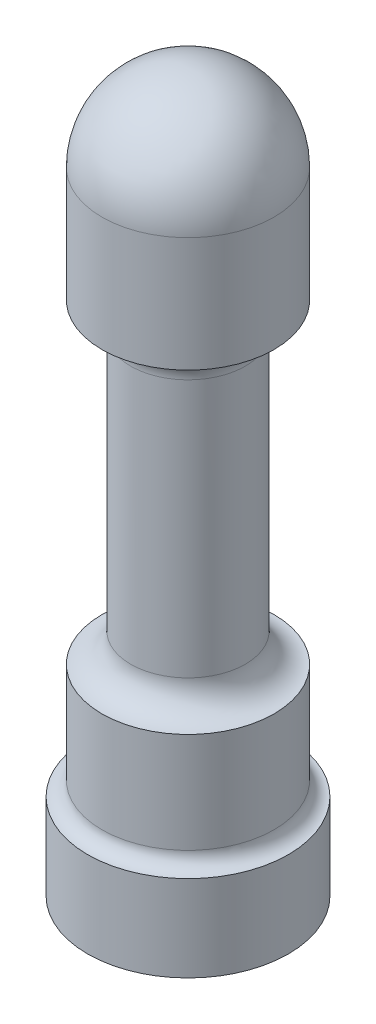
ISO-10303-21;
HEADER;
FILE_DESCRIPTION(('STEP AP214'),'2;1');
FILE_NAME('part.step','',(''),(''),'','','');
FILE_SCHEMA(('AUTOMOTIVE_DESIGN { 1 0 10303 214 1 1 1 1 }'));
ENDSEC;
DATA;
#1=APPLICATION_CONTEXT('core data for automotive mechanical design processes');
#2=APPLICATION_PROTOCOL_DEFINITION('international standard','automotive_design',2000,#1);
#3=PRODUCT_CONTEXT('',#1,'mechanical');
#4=PRODUCT('Part','Part','',(#3));
#5=PRODUCT_RELATED_PRODUCT_CATEGORY('part','',(#4));
#6=PRODUCT_DEFINITION_FORMATION('','',#4);
#7=PRODUCT_DEFINITION_CONTEXT('part definition',#1,'design');
#8=PRODUCT_DEFINITION('design','',#6,#7);
#9=PRODUCT_DEFINITION_SHAPE('','',#8);
#10=(LENGTH_UNIT() NAMED_UNIT(*) SI_UNIT(.MILLI.,.METRE.));
#11=(NAMED_UNIT(*) PLANE_ANGLE_UNIT() SI_UNIT($,.RADIAN.));
#12=(NAMED_UNIT(*) SI_UNIT($,.STERADIAN.) SOLID_ANGLE_UNIT());
#13=UNCERTAINTY_MEASURE_WITH_UNIT(LENGTH_MEASURE(1.E-05),#10,'distance_accuracy_value','');
#14=(GEOMETRIC_REPRESENTATION_CONTEXT(3) GLOBAL_UNCERTAINTY_ASSIGNED_CONTEXT((#13)) GLOBAL_UNIT_ASSIGNED_CONTEXT((#10,
#11,#12)) REPRESENTATION_CONTEXT('',''));
#15=CARTESIAN_POINT('',(0.,0.,0.));
#16=DIRECTION('',(0.,0.,1.));
#17=DIRECTION('',(1.,0.,0.));
#18=AXIS2_PLACEMENT_3D('',#15,#16,#17);
#19=CARTESIAN_POINT('',(0.,0.,0.));
#20=DIRECTION('',(0.,1.,0.));
#21=DIRECTION('',(-1.,0.,0.));
#22=AXIS2_PLACEMENT_3D('',#19,#20,#21);
#23=PLANE('',#22);
#24=CARTESIAN_POINT('',(0.,0.,0.));
#25=DIRECTION('',(0.,1.,0.));
#26=DIRECTION('',(-1.,0.,0.));
#27=AXIS2_PLACEMENT_3D('',#24,#25,#26);
#28=CIRCLE('',#27,1.5);
#29=CARTESIAN_POINT('',(-1.5,0.,0.));
#30=VERTEX_POINT('',#29);
#31=EDGE_CURVE('E83',#30,#30,#28,.T.);
#32=ORIENTED_EDGE('',*,*,#31,.T.);
#33=EDGE_LOOP('',(#32));
#34=FACE_BOUND('',#33,.T.);
#35=CARTESIAN_POINT('',(0.,0.,0.));
#36=DIRECTION('',(0.,1.,0.));
#37=DIRECTION('',(-1.,0.,0.));
#38=AXIS2_PLACEMENT_3D('',#35,#36,#37);
#39=CIRCLE('',#38,3.5);
#40=CARTESIAN_POINT('',(-3.5,0.,0.));
#41=VERTEX_POINT('',#40);
#42=EDGE_CURVE('E67',#41,#41,#39,.T.);
#43=ORIENTED_EDGE('',*,*,#42,.F.);
#44=EDGE_LOOP('',(#43));
#45=FACE_BOUND('',#44,.T.);
#46=ADVANCED_FACE('F43',(#34,#45),#23,.F.);
#47=CARTESIAN_POINT('',(0.,25.,0.));
#48=DIRECTION('',(0.,1.,0.));
#49=DIRECTION('',(-1.,0.,0.));
#50=AXIS2_PLACEMENT_3D('',#47,#48,#49);
#51=CYLINDRICAL_SURFACE('',#50,3.5);
#52=CARTESIAN_POINT('',(0.,3.,0.));
#53=DIRECTION('',(0.,1.,0.));
#54=DIRECTION('',(-1.,0.,0.));
#55=AXIS2_PLACEMENT_3D('',#52,#53,#54);
#56=CIRCLE('',#55,3.5);
#57=CARTESIAN_POINT('',(-3.5,3.,0.));
#58=VERTEX_POINT('',#57);
#59=EDGE_CURVE('E71',#58,#58,#56,.T.);
#60=ORIENTED_EDGE('',*,*,#59,.F.);
#61=EDGE_LOOP('',(#60));
#62=FACE_BOUND('',#61,.T.);
#63=ORIENTED_EDGE('',*,*,#42,.T.);
#64=EDGE_LOOP('',(#63));
#65=FACE_BOUND('',#64,.T.);
#66=ADVANCED_FACE('F100',(#62,#65),#51,.T.);
#67=CARTESIAN_POINT('',(0.,25.,0.));
#68=DIRECTION('',(0.,1.,0.));
#69=DIRECTION('',(-1.,0.,0.));
#70=AXIS2_PLACEMENT_3D('',#67,#68,#69);
#71=CYLINDRICAL_SURFACE('',#70,3.);
#72=CARTESIAN_POINT('',(0.,3.5,0.));
#73=DIRECTION('',(0.,-1.,0.));
#74=DIRECTION('',(1.,0.,0.));
#75=AXIS2_PLACEMENT_3D('',#72,#73,#74);
#76=CIRCLE('',#75,3.);
#77=CARTESIAN_POINT('',(3.,3.5,0.));
#78=VERTEX_POINT('',#77);
#79=EDGE_CURVE('E10',#78,#78,#76,.F.);
#80=ORIENTED_EDGE('',*,*,#79,.T.);
#81=EDGE_LOOP('',(#80));
#82=FACE_BOUND('',#81,.T.);
#83=CARTESIAN_POINT('',(0.,7.,0.));
#84=DIRECTION('',(0.,1.,0.));
#85=DIRECTION('',(-1.,0.,0.));
#86=AXIS2_PLACEMENT_3D('',#83,#84,#85);
#87=CIRCLE('',#86,3.);
#88=CARTESIAN_POINT('',(-3.,7.,0.));
#89=VERTEX_POINT('',#88);
#90=EDGE_CURVE('E75',#89,#89,#87,.T.);
#91=ORIENTED_EDGE('',*,*,#90,.F.);
#92=EDGE_LOOP('',(#91));
#93=FACE_BOUND('',#92,.T.);
#94=ADVANCED_FACE('F105',(#82,#93),#71,.T.);
#95=CARTESIAN_POINT('',(0.,25.,0.));
#96=DIRECTION('',(0.,1.,0.));
#97=DIRECTION('',(-1.,0.,0.));
#98=AXIS2_PLACEMENT_3D('',#95,#96,#97);
#99=CYLINDRICAL_SURFACE('',#98,2.);
#100=CARTESIAN_POINT('',(0.,17.,0.));
#101=DIRECTION('',(0.,1.,0.));
#102=DIRECTION('',(-1.,0.,0.));
#103=AXIS2_PLACEMENT_3D('',#100,#101,#102);
#104=CIRCLE('',#103,2.);
#105=CARTESIAN_POINT('',(-2.,17.,0.));
#106=VERTEX_POINT('',#105);
#107=EDGE_CURVE('E51',#106,#106,#104,.F.);
#108=ORIENTED_EDGE('',*,*,#107,.T.);
#109=EDGE_LOOP('',(#108));
#110=FACE_BOUND('',#109,.T.);
#111=CARTESIAN_POINT('',(0.,8.,0.));
#112=DIRECTION('',(0.,-1.,0.));
#113=DIRECTION('',(1.,0.,0.));
#114=AXIS2_PLACEMENT_3D('',#111,#112,#113);
#115=CIRCLE('',#114,2.);
#116=CARTESIAN_POINT('',(2.,8.,0.));
#117=VERTEX_POINT('',#116);
#118=EDGE_CURVE('E56',#117,#117,#115,.F.);
#119=ORIENTED_EDGE('',*,*,#118,.T.);
#120=EDGE_LOOP('',(#119));
#121=FACE_BOUND('',#120,.T.);
#122=ADVANCED_FACE('F127',(#110,#121),#99,.T.);
#123=CARTESIAN_POINT('',(0.,25.,0.));
#124=DIRECTION('',(0.,1.,0.));
#125=DIRECTION('',(-1.,0.,0.));
#126=AXIS2_PLACEMENT_3D('',#123,#124,#125);
#127=CYLINDRICAL_SURFACE('',#126,3.);
#128=CARTESIAN_POINT('',(0.,22.,0.));
#129=DIRECTION('',(0.,1.,0.));
#130=DIRECTION('',(-1.,0.,0.));
#131=AXIS2_PLACEMENT_3D('',#128,#129,#130);
#132=CIRCLE('',#131,3.);
#133=CARTESIAN_POINT('',(-3.,22.,0.));
#134=VERTEX_POINT('',#133);
#135=EDGE_CURVE('E61',#134,#134,#132,.F.);
#136=ORIENTED_EDGE('',*,*,#135,.T.);
#137=EDGE_LOOP('',(#136));
#138=FACE_BOUND('',#137,.T.);
#139=CARTESIAN_POINT('',(0.,18.,0.));
#140=DIRECTION('',(0.,1.,0.));
#141=DIRECTION('',(-1.,0.,0.));
#142=AXIS2_PLACEMENT_3D('',#139,#140,#141);
#143=CIRCLE('',#142,3.);
#144=CARTESIAN_POINT('',(-3.,18.,0.));
#145=VERTEX_POINT('',#144);
#146=EDGE_CURVE('E79',#145,#145,#143,.T.);
#147=ORIENTED_EDGE('',*,*,#146,.T.);
#148=EDGE_LOOP('',(#147));
#149=FACE_BOUND('',#148,.T.);
#150=ADVANCED_FACE('F114',(#138,#149),#127,.T.);
#151=CARTESIAN_POINT('',(0.,22.,0.));
#152=DIRECTION('',(0.,-1.,0.));
#153=DIRECTION('',(1.,0.,0.));
#154=AXIS2_PLACEMENT_3D('',#151,#152,#153);
#155=SPHERICAL_SURFACE('',#154,3.);
#156=ORIENTED_EDGE('',*,*,#135,.F.);
#157=EDGE_LOOP('',(#156));
#158=FACE_BOUND('',#157,.T.);
#159=ADVANCED_FACE('F110',(#158),#155,.T.);
#160=CARTESIAN_POINT('',(0.,17.,0.));
#161=DIRECTION('',(0.,1.,0.));
#162=DIRECTION('',(-1.,0.,0.));
#163=AXIS2_PLACEMENT_3D('',#160,#161,#162);
#164=TOROIDAL_SURFACE('',#163,3.,1.);
#165=ORIENTED_EDGE('',*,*,#107,.F.);
#166=EDGE_LOOP('',(#165));
#167=FACE_BOUND('',#166,.T.);
#168=ORIENTED_EDGE('',*,*,#146,.F.);
#169=EDGE_LOOP('',(#168));
#170=FACE_BOUND('',#169,.T.);
#171=ADVANCED_FACE('F113',(#167,#170),#164,.F.);
#172=CARTESIAN_POINT('',(0.,8.,0.));
#173=DIRECTION('',(0.,-1.,0.));
#174=DIRECTION('',(1.,0.,0.));
#175=AXIS2_PLACEMENT_3D('',#172,#173,#174);
#176=TOROIDAL_SURFACE('',#175,3.,1.);
#177=ORIENTED_EDGE('',*,*,#90,.T.);
#178=EDGE_LOOP('',(#177));
#179=FACE_BOUND('',#178,.T.);
#180=ORIENTED_EDGE('',*,*,#118,.F.);
#181=EDGE_LOOP('',(#180));
#182=FACE_BOUND('',#181,.T.);
#183=ADVANCED_FACE('F97',(#179,#182),#176,.F.);
#184=CARTESIAN_POINT('',(0.,3.5,0.));
#185=DIRECTION('',(0.,-1.,0.));
#186=DIRECTION('',(1.,0.,0.));
#187=AXIS2_PLACEMENT_3D('',#184,#185,#186);
#188=TOROIDAL_SURFACE('',#187,3.5,0.5);
#189=ORIENTED_EDGE('',*,*,#59,.T.);
#190=EDGE_LOOP('',(#189));
#191=FACE_BOUND('',#190,.T.);
#192=ORIENTED_EDGE('',*,*,#79,.F.);
#193=EDGE_LOOP('',(#192));
#194=FACE_BOUND('',#193,.T.);
#195=ADVANCED_FACE('F45',(#191,#194),#188,.F.);
#196=CARTESIAN_POINT('',(0.,0.,0.));
#197=DIRECTION('',(0.,1.,0.));
#198=DIRECTION('',(1.,0.,0.));
#199=AXIS2_PLACEMENT_3D('',#196,#197,#198);
#200=SPHERICAL_SURFACE('',#199,1.5);
#201=ORIENTED_EDGE('',*,*,#31,.F.);
#202=EDGE_LOOP('',(#201));
#203=FACE_BOUND('',#202,.T.);
#204=ADVANCED_FACE('F90',(#203),#200,.F.);
#205=CLOSED_SHELL('',(#46,#66,#94,#122,#150,#159,#171,#183,#195,#204));
#206=MANIFOLD_SOLID_BREP('B2',#205);
#207=ADVANCED_BREP_SHAPE_REPRESENTATION('',(#18,#206),#14);
#208=SHAPE_DEFINITION_REPRESENTATION(#9,#207);
ENDSEC;
END-ISO-10303-21;
